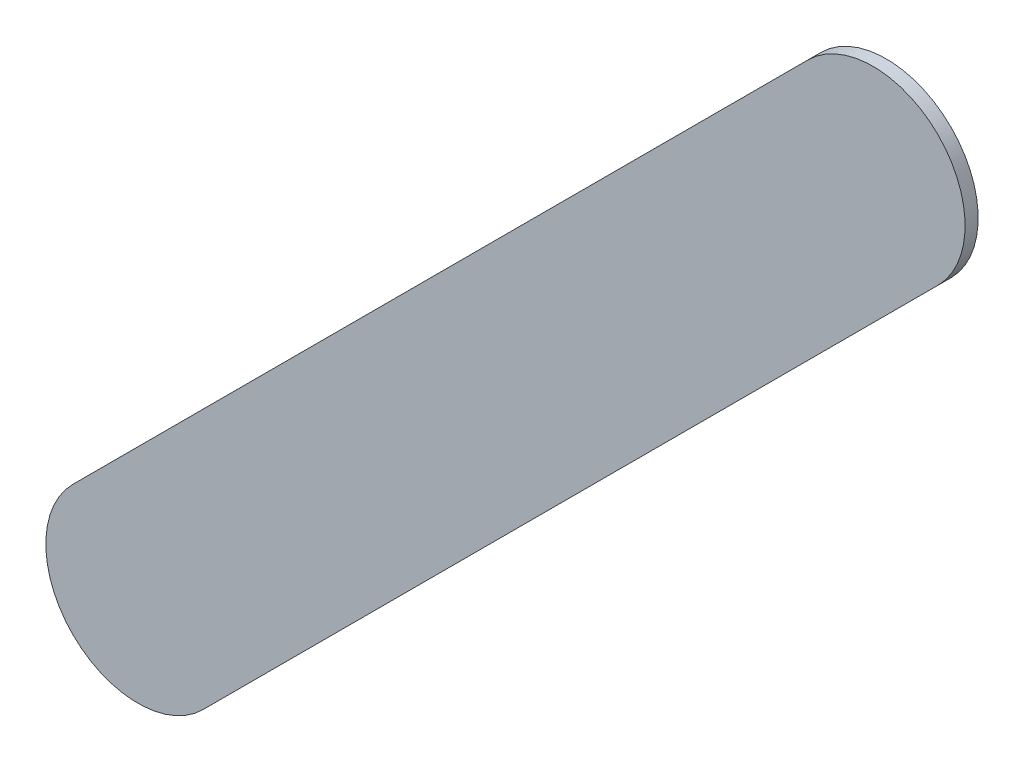
ISO-10303-21;
HEADER;
FILE_DESCRIPTION(('STEP AP214'),'2;1');
FILE_NAME('part.step','',(''),(''),'','','');
FILE_SCHEMA(('AUTOMOTIVE_DESIGN { 1 0 10303 214 1 1 1 1 }'));
ENDSEC;
DATA;
#1=APPLICATION_CONTEXT('core data for automotive mechanical design processes');
#2=APPLICATION_PROTOCOL_DEFINITION('international standard','automotive_design',2000,#1);
#3=PRODUCT_CONTEXT('',#1,'mechanical');
#4=PRODUCT('Part','Part','',(#3));
#5=PRODUCT_RELATED_PRODUCT_CATEGORY('part','',(#4));
#6=PRODUCT_DEFINITION_FORMATION('','',#4);
#7=PRODUCT_DEFINITION_CONTEXT('part definition',#1,'design');
#8=PRODUCT_DEFINITION('design','',#6,#7);
#9=PRODUCT_DEFINITION_SHAPE('','',#8);
#10=(LENGTH_UNIT() NAMED_UNIT(*) SI_UNIT(.MILLI.,.METRE.));
#11=(NAMED_UNIT(*) PLANE_ANGLE_UNIT() SI_UNIT($,.RADIAN.));
#12=(NAMED_UNIT(*) SI_UNIT($,.STERADIAN.) SOLID_ANGLE_UNIT());
#13=UNCERTAINTY_MEASURE_WITH_UNIT(LENGTH_MEASURE(1.E-05),#10,'distance_accuracy_value','');
#14=(GEOMETRIC_REPRESENTATION_CONTEXT(3) GLOBAL_UNCERTAINTY_ASSIGNED_CONTEXT((#13)) GLOBAL_UNIT_ASSIGNED_CONTEXT((#10,
#11,#12)) REPRESENTATION_CONTEXT('',''));
#15=CARTESIAN_POINT('',(0.,0.,0.));
#16=DIRECTION('',(0.,0.,1.));
#17=DIRECTION('',(1.,0.,0.));
#18=AXIS2_PLACEMENT_3D('',#15,#16,#17);
#19=CARTESIAN_POINT('',(87.0767753,91.8232225,0.));
#20=DIRECTION('',(-0.707106781186545,0.70710678118655,0.));
#21=DIRECTION('',(0.70710678118655,0.707106781186545,0.));
#22=AXIS2_PLACEMENT_3D('',#19,#20,#21);
#23=PLANE('',#22);
#24=DIRECTION('',(0.70710678118655,0.707106781186545,0.));
#25=VECTOR('',#24,1.);
#26=CARTESIAN_POINT('',(87.0767753,91.8232225,0.03556));
#27=LINE('',#26,#25);
#28=CARTESIAN_POINT('',(87.0767753,91.8232225,0.03556));
#29=VERTEX_POINT('',#28);
#30=CARTESIAN_POINT('',(89.07500854,93.82145574,0.03556));
#31=VERTEX_POINT('',#30);
#32=EDGE_CURVE('E11',#29,#31,#27,.T.);
#33=ORIENTED_EDGE('',*,*,#32,.F.);
#34=DIRECTION('',(0.,0.,1.));
#35=VECTOR('',#34,1.);
#36=CARTESIAN_POINT('',(87.0767753,91.8232225,0.));
#37=LINE('',#36,#35);
#38=CARTESIAN_POINT('',(87.0767753,91.8232225,0.));
#39=VERTEX_POINT('',#38);
#40=EDGE_CURVE('E24',#39,#29,#37,.T.);
#41=ORIENTED_EDGE('',*,*,#40,.F.);
#42=DIRECTION('',(0.70710678118655,0.707106781186545,0.));
#43=VECTOR('',#42,1.);
#44=CARTESIAN_POINT('',(87.0767753,91.8232225,0.));
#45=LINE('',#44,#43);
#46=CARTESIAN_POINT('',(89.07500854,93.82145574,0.));
#47=VERTEX_POINT('',#46);
#48=EDGE_CURVE('E75',#39,#47,#45,.T.);
#49=ORIENTED_EDGE('',*,*,#48,.T.);
#50=DIRECTION('',(0.,0.,1.));
#51=VECTOR('',#50,1.);
#52=CARTESIAN_POINT('',(89.07500854,93.82145574,0.));
#53=LINE('',#52,#51);
#54=EDGE_CURVE('E37',#47,#31,#53,.T.);
#55=ORIENTED_EDGE('',*,*,#54,.T.);
#56=EDGE_LOOP('',(#33,#41,#49,#55));
#57=FACE_BOUND('',#56,.T.);
#58=ADVANCED_FACE('F17',(#57),#23,.F.);
#59=CARTESIAN_POINT('',(88.89823216,93.99823212,0.));
#60=DIRECTION('',(0.,0.,-1.));
#61=DIRECTION('',(0.707106781186576,-0.707106781186519,0.));
#62=AXIS2_PLACEMENT_3D('',#59,#60,#61);
#63=CYLINDRICAL_SURFACE('',#62,0.249999554103223);
#64=CARTESIAN_POINT('',(88.89823216,93.99823212,0.03556));
#65=DIRECTION('',(0.,0.,1.));
#66=DIRECTION('',(0.707106781186576,-0.707106781186519,0.));
#67=AXIS2_PLACEMENT_3D('',#64,#65,#66);
#68=CIRCLE('',#67,0.249999554103223);
#69=CARTESIAN_POINT('',(88.72145578,94.1750085,0.03556));
#70=VERTEX_POINT('',#69);
#71=EDGE_CURVE('E83',#31,#70,#68,.T.);
#72=ORIENTED_EDGE('',*,*,#71,.F.);
#73=ORIENTED_EDGE('',*,*,#54,.F.);
#74=CARTESIAN_POINT('',(88.89823216,93.99823212,0.));
#75=DIRECTION('',(0.,0.,1.));
#76=DIRECTION('',(0.707106781186576,-0.707106781186519,0.));
#77=AXIS2_PLACEMENT_3D('',#74,#75,#76);
#78=CIRCLE('',#77,0.249999554103223);
#79=CARTESIAN_POINT('',(88.72145578,94.1750085,0.));
#80=VERTEX_POINT('',#79);
#81=EDGE_CURVE('E81',#47,#80,#78,.T.);
#82=ORIENTED_EDGE('',*,*,#81,.T.);
#83=DIRECTION('',(0.,0.,1.));
#84=VECTOR('',#83,1.);
#85=CARTESIAN_POINT('',(88.72145578,94.1750085,0.));
#86=LINE('',#85,#84);
#87=EDGE_CURVE('E67',#80,#70,#86,.T.);
#88=ORIENTED_EDGE('',*,*,#87,.T.);
#89=EDGE_LOOP('',(#72,#73,#82,#88));
#90=FACE_BOUND('',#89,.T.);
#91=ADVANCED_FACE('F89',(#90),#63,.T.);
#92=CARTESIAN_POINT('',(88.72145578,94.1750085,0.));
#93=DIRECTION('',(0.707106781186545,-0.70710678118655,0.));
#94=DIRECTION('',(-0.70710678118655,-0.707106781186545,0.));
#95=AXIS2_PLACEMENT_3D('',#92,#93,#94);
#96=PLANE('',#95);
#97=DIRECTION('',(-0.70710678118655,-0.707106781186545,0.));
#98=VECTOR('',#97,1.);
#99=CARTESIAN_POINT('',(88.72145578,94.1750085,0.03556));
#100=LINE('',#99,#98);
#101=CARTESIAN_POINT('',(86.72322254,92.17677526,0.03556));
#102=VERTEX_POINT('',#101);
#103=EDGE_CURVE('E71',#70,#102,#100,.T.);
#104=ORIENTED_EDGE('',*,*,#103,.F.);
#105=ORIENTED_EDGE('',*,*,#87,.F.);
#106=DIRECTION('',(-0.70710678118655,-0.707106781186545,0.));
#107=VECTOR('',#106,1.);
#108=CARTESIAN_POINT('',(88.72145578,94.1750085,0.));
#109=LINE('',#108,#107);
#110=CARTESIAN_POINT('',(86.72322254,92.17677526,0.));
#111=VERTEX_POINT('',#110);
#112=EDGE_CURVE('E63',#80,#111,#109,.T.);
#113=ORIENTED_EDGE('',*,*,#112,.T.);
#114=DIRECTION('',(0.,0.,1.));
#115=VECTOR('',#114,1.);
#116=CARTESIAN_POINT('',(86.72322254,92.17677526,0.));
#117=LINE('',#116,#115);
#118=EDGE_CURVE('E53',#111,#102,#117,.T.);
#119=ORIENTED_EDGE('',*,*,#118,.T.);
#120=EDGE_LOOP('',(#104,#105,#113,#119));
#121=FACE_BOUND('',#120,.T.);
#122=ADVANCED_FACE('F66',(#121),#96,.F.);
#123=CARTESIAN_POINT('',(86.89999892,91.99999888,0.));
#124=DIRECTION('',(0.,0.,-1.));
#125=DIRECTION('',(-0.707106781186548,0.707106781186548,0.));
#126=AXIS2_PLACEMENT_3D('',#123,#124,#125);
#127=CYLINDRICAL_SURFACE('',#126,0.24999955410322);
#128=CARTESIAN_POINT('',(86.89999892,91.99999888,0.03556));
#129=DIRECTION('',(0.,0.,1.));
#130=DIRECTION('',(-0.707106781186548,0.707106781186548,0.));
#131=AXIS2_PLACEMENT_3D('',#128,#129,#130);
#132=CIRCLE('',#131,0.24999955410322);
#133=EDGE_CURVE('E59',#102,#29,#132,.T.);
#134=ORIENTED_EDGE('',*,*,#133,.F.);
#135=ORIENTED_EDGE('',*,*,#118,.F.);
#136=CARTESIAN_POINT('',(86.89999892,91.99999888,0.));
#137=DIRECTION('',(0.,0.,1.));
#138=DIRECTION('',(-0.707106781186548,0.707106781186548,0.));
#139=AXIS2_PLACEMENT_3D('',#136,#137,#138);
#140=CIRCLE('',#139,0.24999955410322);
#141=EDGE_CURVE('E57',#111,#39,#140,.T.);
#142=ORIENTED_EDGE('',*,*,#141,.T.);
#143=ORIENTED_EDGE('',*,*,#40,.T.);
#144=EDGE_LOOP('',(#134,#135,#142,#143));
#145=FACE_BOUND('',#144,.T.);
#146=ADVANCED_FACE('F55',(#145),#127,.T.);
#147=CARTESIAN_POINT('',(87.0767753,91.8232225,0.));
#148=DIRECTION('',(0.,0.,-1.));
#149=DIRECTION('',(-1.,0.,0.));
#150=AXIS2_PLACEMENT_3D('',#147,#148,#149);
#151=PLANE('',#150);
#152=ORIENTED_EDGE('',*,*,#141,.F.);
#153=ORIENTED_EDGE('',*,*,#112,.F.);
#154=ORIENTED_EDGE('',*,*,#81,.F.);
#155=ORIENTED_EDGE('',*,*,#48,.F.);
#156=EDGE_LOOP('',(#152,#153,#154,#155));
#157=FACE_BOUND('',#156,.T.);
#158=ADVANCED_FACE('F74',(#157),#151,.T.);
#159=CARTESIAN_POINT('',(87.0767753,91.8232225,0.03556));
#160=DIRECTION('',(0.,0.,-1.));
#161=DIRECTION('',(-1.,0.,0.));
#162=AXIS2_PLACEMENT_3D('',#159,#160,#161);
#163=PLANE('',#162);
#164=ORIENTED_EDGE('',*,*,#32,.T.);
#165=ORIENTED_EDGE('',*,*,#71,.T.);
#166=ORIENTED_EDGE('',*,*,#103,.T.);
#167=ORIENTED_EDGE('',*,*,#133,.T.);
#168=EDGE_LOOP('',(#164,#165,#166,#167));
#169=FACE_BOUND('',#168,.T.);
#170=ADVANCED_FACE('F91',(#169),#163,.F.);
#171=CLOSED_SHELL('',(#58,#91,#122,#146,#158,#170));
#172=MANIFOLD_SOLID_BREP('B1',#171);
#173=ADVANCED_BREP_SHAPE_REPRESENTATION('',(#18,#172),#14);
#174=SHAPE_DEFINITION_REPRESENTATION(#9,#173);
ENDSEC;
END-ISO-10303-21;
